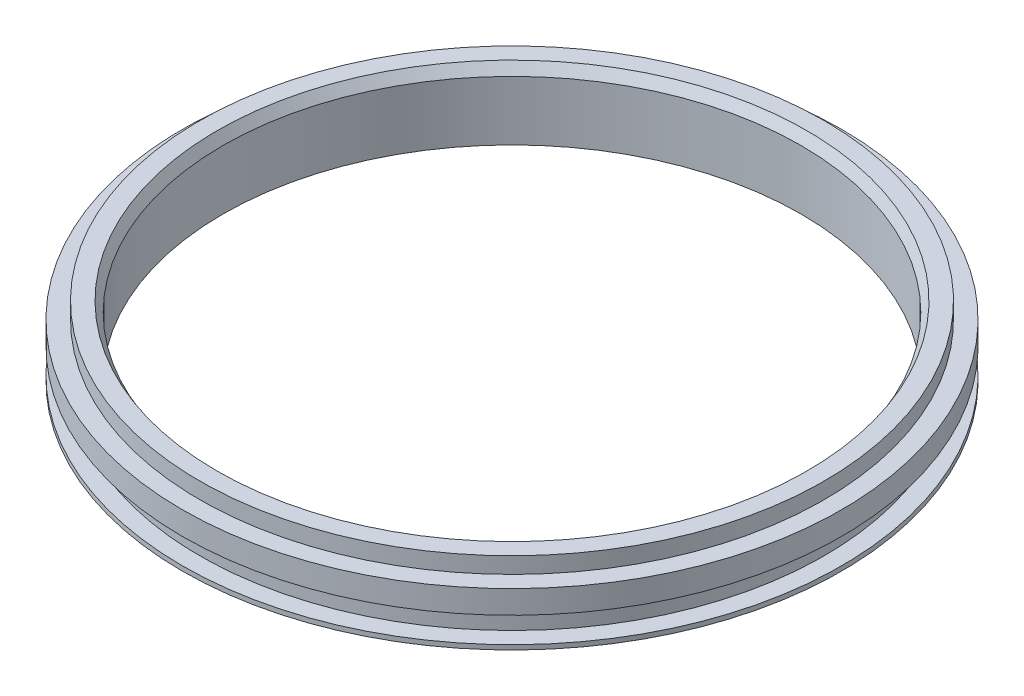
ISO-10303-21;
HEADER;
FILE_DESCRIPTION(('STEP AP214'),'2;1');
FILE_NAME('part.step','',(''),(''),'','','');
FILE_SCHEMA(('AUTOMOTIVE_DESIGN { 1 0 10303 214 1 1 1 1 }'));
ENDSEC;
DATA;
#1=APPLICATION_CONTEXT('core data for automotive mechanical design processes');
#2=APPLICATION_PROTOCOL_DEFINITION('international standard','automotive_design',2000,#1);
#3=PRODUCT_CONTEXT('',#1,'mechanical');
#4=PRODUCT('Part','Part','',(#3));
#5=PRODUCT_RELATED_PRODUCT_CATEGORY('part','',(#4));
#6=PRODUCT_DEFINITION_FORMATION('','',#4);
#7=PRODUCT_DEFINITION_CONTEXT('part definition',#1,'design');
#8=PRODUCT_DEFINITION('design','',#6,#7);
#9=PRODUCT_DEFINITION_SHAPE('','',#8);
#10=(LENGTH_UNIT() NAMED_UNIT(*) SI_UNIT(.MILLI.,.METRE.));
#11=(NAMED_UNIT(*) PLANE_ANGLE_UNIT() SI_UNIT($,.RADIAN.));
#12=(NAMED_UNIT(*) SI_UNIT($,.STERADIAN.) SOLID_ANGLE_UNIT());
#13=UNCERTAINTY_MEASURE_WITH_UNIT(LENGTH_MEASURE(1.E-05),#10,'distance_accuracy_value','');
#14=(GEOMETRIC_REPRESENTATION_CONTEXT(3) GLOBAL_UNCERTAINTY_ASSIGNED_CONTEXT((#13)) GLOBAL_UNIT_ASSIGNED_CONTEXT((#10,
#11,#12)) REPRESENTATION_CONTEXT('',''));
#15=CARTESIAN_POINT('',(0.,0.,0.));
#16=DIRECTION('',(0.,0.,1.));
#17=DIRECTION('',(1.,0.,0.));
#18=AXIS2_PLACEMENT_3D('',#15,#16,#17);
#19=CARTESIAN_POINT('',(0.,-1.1,-27.));
#20=DIRECTION('',(0.,1.,0.));
#21=DIRECTION('',(0.,0.,1.));
#22=AXIS2_PLACEMENT_3D('',#19,#20,#21);
#23=PLANE('',#22);
#24=CARTESIAN_POINT('',(0.,-1.1,0.));
#25=DIRECTION('',(0.,-1.,0.));
#26=DIRECTION('',(0.,0.,-1.));
#27=AXIS2_PLACEMENT_3D('',#24,#25,#26);
#28=CIRCLE('',#27,27.);
#29=CARTESIAN_POINT('',(0.,-1.1,-27.));
#30=VERTEX_POINT('',#29);
#31=EDGE_CURVE('E55',#30,#30,#28,.T.);
#32=ORIENTED_EDGE('',*,*,#31,.T.);
#33=EDGE_LOOP('',(#32));
#34=FACE_BOUND('',#33,.T.);
#35=CARTESIAN_POINT('',(0.,-1.1,0.));
#36=DIRECTION('',(0.,-1.,0.));
#37=DIRECTION('',(0.,0.,-1.));
#38=AXIS2_PLACEMENT_3D('',#35,#36,#37);
#39=CIRCLE('',#38,28.5);
#40=CARTESIAN_POINT('',(0.,-1.1,-28.5));
#41=VERTEX_POINT('',#40);
#42=EDGE_CURVE('E59',#41,#41,#39,.T.);
#43=ORIENTED_EDGE('',*,*,#42,.F.);
#44=EDGE_LOOP('',(#43));
#45=FACE_BOUND('',#44,.T.);
#46=ADVANCED_FACE('F43',(#34,#45),#23,.T.);
#47=CARTESIAN_POINT('',(0.,0.,0.));
#48=DIRECTION('',(0.,-1.,0.));
#49=DIRECTION('',(0.,0.,-1.));
#50=AXIS2_PLACEMENT_3D('',#47,#48,#49);
#51=CYLINDRICAL_SURFACE('',#50,28.5);
#52=ORIENTED_EDGE('',*,*,#42,.T.);
#53=EDGE_LOOP('',(#52));
#54=FACE_BOUND('',#53,.T.);
#55=CARTESIAN_POINT('',(0.,-1.49999999999999,0.));
#56=DIRECTION('',(0.,-1.,0.));
#57=DIRECTION('',(0.,0.,-1.));
#58=AXIS2_PLACEMENT_3D('',#55,#56,#57);
#59=CIRCLE('',#58,28.5);
#60=CARTESIAN_POINT('',(0.,-1.49999999999999,-28.5));
#61=VERTEX_POINT('',#60);
#62=EDGE_CURVE('E64',#61,#61,#59,.T.);
#63=ORIENTED_EDGE('',*,*,#62,.F.);
#64=EDGE_LOOP('',(#63));
#65=FACE_BOUND('',#64,.T.);
#66=ADVANCED_FACE('F103',(#54,#65),#51,.T.);
#67=CARTESIAN_POINT('',(0.,-1.49999999999999,-28.5));
#68=DIRECTION('',(0.,-1.,0.));
#69=DIRECTION('',(0.,0.,-1.));
#70=AXIS2_PLACEMENT_3D('',#67,#68,#69);
#71=PLANE('',#70);
#72=ORIENTED_EDGE('',*,*,#62,.T.);
#73=EDGE_LOOP('',(#72));
#74=FACE_BOUND('',#73,.T.);
#75=CARTESIAN_POINT('',(0.,-1.49999999999999,0.));
#76=DIRECTION('',(0.,-1.,0.));
#77=DIRECTION('',(0.,0.,-1.));
#78=AXIS2_PLACEMENT_3D('',#75,#76,#77);
#79=CIRCLE('',#78,25.);
#80=CARTESIAN_POINT('',(0.,-1.49999999999999,-25.));
#81=VERTEX_POINT('',#80);
#82=EDGE_CURVE('E67',#81,#81,#79,.T.);
#83=ORIENTED_EDGE('',*,*,#82,.F.);
#84=EDGE_LOOP('',(#83));
#85=FACE_BOUND('',#84,.T.);
#86=ADVANCED_FACE('F108',(#74,#85),#71,.T.);
#87=CARTESIAN_POINT('',(0.,0.,0.));
#88=DIRECTION('',(0.,-1.,0.));
#89=DIRECTION('',(0.,0.,-1.));
#90=AXIS2_PLACEMENT_3D('',#87,#88,#89);
#91=CYLINDRICAL_SURFACE('',#90,25.);
#92=CARTESIAN_POINT('',(0.,3.63397459621555,0.));
#93=DIRECTION('',(0.,1.,0.));
#94=DIRECTION('',(0.,0.,1.));
#95=AXIS2_PLACEMENT_3D('',#92,#93,#94);
#96=CIRCLE('',#95,25.);
#97=CARTESIAN_POINT('',(0.,3.63397459621555,25.));
#98=VERTEX_POINT('',#97);
#99=EDGE_CURVE('E10',#98,#98,#96,.T.);
#100=ORIENTED_EDGE('',*,*,#99,.T.);
#101=EDGE_LOOP('',(#100));
#102=FACE_BOUND('',#101,.T.);
#103=ORIENTED_EDGE('',*,*,#82,.T.);
#104=EDGE_LOOP('',(#103));
#105=FACE_BOUND('',#104,.T.);
#106=ADVANCED_FACE('F115',(#102,#105),#91,.F.);
#107=CARTESIAN_POINT('',(0.,4.50000000000001,-25.));
#108=DIRECTION('',(0.,1.,0.));
#109=DIRECTION('',(0.,0.,1.));
#110=AXIS2_PLACEMENT_3D('',#107,#108,#109);
#111=PLANE('',#110);
#112=CARTESIAN_POINT('',(0.,4.50000000000001,0.));
#113=DIRECTION('',(0.,1.,0.));
#114=DIRECTION('',(0.,0.,1.));
#115=AXIS2_PLACEMENT_3D('',#112,#113,#114);
#116=CIRCLE('',#115,25.5);
#117=CARTESIAN_POINT('',(0.,4.50000000000001,25.5));
#118=VERTEX_POINT('',#117);
#119=EDGE_CURVE('E51',#118,#118,#116,.F.);
#120=ORIENTED_EDGE('',*,*,#119,.T.);
#121=EDGE_LOOP('',(#120));
#122=FACE_BOUND('',#121,.T.);
#123=CARTESIAN_POINT('',(0.,4.50000000000001,0.));
#124=DIRECTION('',(0.,-1.,0.));
#125=DIRECTION('',(0.,0.,-1.));
#126=AXIS2_PLACEMENT_3D('',#123,#124,#125);
#127=CIRCLE('',#126,27.);
#128=CARTESIAN_POINT('',(0.,4.50000000000001,-27.));
#129=VERTEX_POINT('',#128);
#130=EDGE_CURVE('E70',#129,#129,#127,.T.);
#131=ORIENTED_EDGE('',*,*,#130,.F.);
#132=EDGE_LOOP('',(#131));
#133=FACE_BOUND('',#132,.T.);
#134=ADVANCED_FACE('F119',(#122,#133),#111,.T.);
#135=CARTESIAN_POINT('',(0.,0.,0.));
#136=DIRECTION('',(0.,-1.,0.));
#137=DIRECTION('',(0.,0.,-1.));
#138=AXIS2_PLACEMENT_3D('',#135,#136,#137);
#139=CYLINDRICAL_SURFACE('',#138,27.);
#140=ORIENTED_EDGE('',*,*,#130,.T.);
#141=EDGE_LOOP('',(#140));
#142=FACE_BOUND('',#141,.T.);
#143=CARTESIAN_POINT('',(0.,3.1,0.));
#144=DIRECTION('',(0.,-1.,0.));
#145=DIRECTION('',(0.,0.,-1.));
#146=AXIS2_PLACEMENT_3D('',#143,#144,#145);
#147=CIRCLE('',#146,27.);
#148=CARTESIAN_POINT('',(0.,3.1,-27.));
#149=VERTEX_POINT('',#148);
#150=EDGE_CURVE('E73',#149,#149,#147,.T.);
#151=ORIENTED_EDGE('',*,*,#150,.F.);
#152=EDGE_LOOP('',(#151));
#153=FACE_BOUND('',#152,.T.);
#154=ADVANCED_FACE('F122',(#142,#153),#139,.T.);
#155=CARTESIAN_POINT('',(0.,3.1,-28.5));
#156=DIRECTION('',(0.,1.,0.));
#157=DIRECTION('',(0.,0.,1.));
#158=AXIS2_PLACEMENT_3D('',#155,#156,#157);
#159=PLANE('',#158);
#160=ORIENTED_EDGE('',*,*,#150,.T.);
#161=EDGE_LOOP('',(#160));
#162=FACE_BOUND('',#161,.T.);
#163=CARTESIAN_POINT('',(0.,3.1,0.));
#164=DIRECTION('',(0.,-1.,0.));
#165=DIRECTION('',(0.,0.,-1.));
#166=AXIS2_PLACEMENT_3D('',#163,#164,#165);
#167=CIRCLE('',#166,28.5);
#168=CARTESIAN_POINT('',(0.,3.1,-28.5));
#169=VERTEX_POINT('',#168);
#170=EDGE_CURVE('E76',#169,#169,#167,.T.);
#171=ORIENTED_EDGE('',*,*,#170,.F.);
#172=EDGE_LOOP('',(#171));
#173=FACE_BOUND('',#172,.T.);
#174=ADVANCED_FACE('F99',(#162,#173),#159,.T.);
#175=CARTESIAN_POINT('',(0.,0.,0.));
#176=DIRECTION('',(0.,-1.,0.));
#177=DIRECTION('',(0.,0.,-1.));
#178=AXIS2_PLACEMENT_3D('',#175,#176,#177);
#179=CYLINDRICAL_SURFACE('',#178,28.5);
#180=ORIENTED_EDGE('',*,*,#170,.T.);
#181=EDGE_LOOP('',(#180));
#182=FACE_BOUND('',#181,.T.);
#183=CARTESIAN_POINT('',(0.,1.1,0.));
#184=DIRECTION('',(0.,-1.,0.));
#185=DIRECTION('',(0.,0.,-1.));
#186=AXIS2_PLACEMENT_3D('',#183,#184,#185);
#187=CIRCLE('',#186,28.5);
#188=CARTESIAN_POINT('',(0.,1.1,-28.5));
#189=VERTEX_POINT('',#188);
#190=EDGE_CURVE('E79',#189,#189,#187,.T.);
#191=ORIENTED_EDGE('',*,*,#190,.F.);
#192=EDGE_LOOP('',(#191));
#193=FACE_BOUND('',#192,.T.);
#194=ADVANCED_FACE('F91',(#182,#193),#179,.T.);
#195=CARTESIAN_POINT('',(0.,1.1,-27.));
#196=DIRECTION('',(0.,-1.,0.));
#197=DIRECTION('',(0.,0.,-1.));
#198=AXIS2_PLACEMENT_3D('',#195,#196,#197);
#199=PLANE('',#198);
#200=ORIENTED_EDGE('',*,*,#190,.T.);
#201=EDGE_LOOP('',(#200));
#202=FACE_BOUND('',#201,.T.);
#203=CARTESIAN_POINT('',(0.,1.1,0.));
#204=DIRECTION('',(0.,-1.,0.));
#205=DIRECTION('',(0.,0.,-1.));
#206=AXIS2_PLACEMENT_3D('',#203,#204,#205);
#207=CIRCLE('',#206,27.);
#208=CARTESIAN_POINT('',(0.,1.1,-27.));
#209=VERTEX_POINT('',#208);
#210=EDGE_CURVE('E82',#209,#209,#207,.T.);
#211=ORIENTED_EDGE('',*,*,#210,.F.);
#212=EDGE_LOOP('',(#211));
#213=FACE_BOUND('',#212,.T.);
#214=ADVANCED_FACE('F89',(#202,#213),#199,.T.);
#215=CARTESIAN_POINT('',(0.,0.,0.));
#216=DIRECTION('',(0.,-1.,0.));
#217=DIRECTION('',(0.,0.,-1.));
#218=AXIS2_PLACEMENT_3D('',#215,#216,#217);
#219=CYLINDRICAL_SURFACE('',#218,27.);
#220=ORIENTED_EDGE('',*,*,#210,.T.);
#221=EDGE_LOOP('',(#220));
#222=FACE_BOUND('',#221,.T.);
#223=ORIENTED_EDGE('',*,*,#31,.F.);
#224=EDGE_LOOP('',(#223));
#225=FACE_BOUND('',#224,.T.);
#226=ADVANCED_FACE('F86',(#222,#225),#219,.T.);
#227=CARTESIAN_POINT('',(0.,4.50000000000001,0.));
#228=DIRECTION('',(0.,1.,0.));
#229=DIRECTION('',(0.,0.,1.));
#230=AXIS2_PLACEMENT_3D('',#227,#228,#229);
#231=CONICAL_SURFACE('',#230,25.5,0.523598775598293);
#232=ORIENTED_EDGE('',*,*,#99,.F.);
#233=EDGE_LOOP('',(#232));
#234=FACE_BOUND('',#233,.T.);
#235=ORIENTED_EDGE('',*,*,#119,.F.);
#236=EDGE_LOOP('',(#235));
#237=FACE_BOUND('',#236,.T.);
#238=ADVANCED_FACE('F46',(#234,#237),#231,.F.);
#239=CLOSED_SHELL('',(#46,#66,#86,#106,#134,#154,#174,#194,#214,#226,#238));
#240=MANIFOLD_SOLID_BREP('B2',#239);
#241=ADVANCED_BREP_SHAPE_REPRESENTATION('',(#18,#240),#14);
#242=SHAPE_DEFINITION_REPRESENTATION(#9,#241);
ENDSEC;
END-ISO-10303-21;
